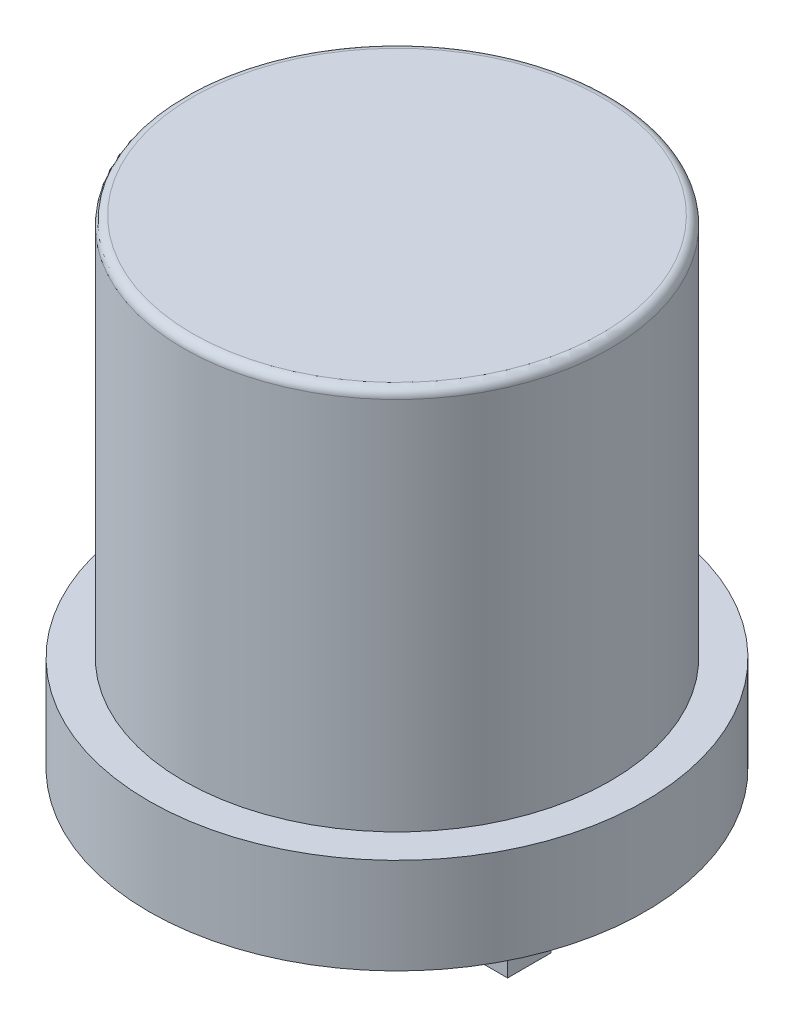
ISO-10303-21;
HEADER;
FILE_DESCRIPTION(('STEP AP214'),'2;1');
FILE_NAME('part.step','',(''),(''),'','','');
FILE_SCHEMA(('AUTOMOTIVE_DESIGN { 1 0 10303 214 1 1 1 1 }'));
ENDSEC;
DATA;
#1=APPLICATION_CONTEXT('core data for automotive mechanical design processes');
#2=APPLICATION_PROTOCOL_DEFINITION('international standard','automotive_design',2000,#1);
#3=PRODUCT_CONTEXT('',#1,'mechanical');
#4=PRODUCT('Part','Part','',(#3));
#5=PRODUCT_RELATED_PRODUCT_CATEGORY('part','',(#4));
#6=PRODUCT_DEFINITION_FORMATION('','',#4);
#7=PRODUCT_DEFINITION_CONTEXT('part definition',#1,'design');
#8=PRODUCT_DEFINITION('design','',#6,#7);
#9=PRODUCT_DEFINITION_SHAPE('','',#8);
#10=(LENGTH_UNIT() NAMED_UNIT(*) SI_UNIT(.MILLI.,.METRE.));
#11=(NAMED_UNIT(*) PLANE_ANGLE_UNIT() SI_UNIT($,.RADIAN.));
#12=(NAMED_UNIT(*) SI_UNIT($,.STERADIAN.) SOLID_ANGLE_UNIT());
#13=UNCERTAINTY_MEASURE_WITH_UNIT(LENGTH_MEASURE(1.E-05),#10,'distance_accuracy_value','');
#14=(GEOMETRIC_REPRESENTATION_CONTEXT(3) GLOBAL_UNCERTAINTY_ASSIGNED_CONTEXT((#13)) GLOBAL_UNIT_ASSIGNED_CONTEXT((#10,
#11,#12)) REPRESENTATION_CONTEXT('',''));
#15=CARTESIAN_POINT('',(0.,0.,0.));
#16=DIRECTION('',(0.,0.,1.));
#17=DIRECTION('',(1.,0.,0.));
#18=AXIS2_PLACEMENT_3D('',#15,#16,#17);
#19=CARTESIAN_POINT('',(2.85,1.1,0.));
#20=DIRECTION('',(0.,1.,0.));
#21=DIRECTION('',(0.,0.,1.));
#22=AXIS2_PLACEMENT_3D('',#19,#20,#21);
#23=PLANE('',#22);
#24=CARTESIAN_POINT('',(0.,1.1,0.));
#25=DIRECTION('',(0.,-1.,0.));
#26=DIRECTION('',(0.,0.,-1.));
#27=AXIS2_PLACEMENT_3D('',#24,#25,#26);
#28=CIRCLE('',#27,2.85);
#29=CARTESIAN_POINT('',(0.,1.1,-2.85));
#30=VERTEX_POINT('',#29);
#31=EDGE_CURVE('E344',#30,#30,#28,.T.);
#32=ORIENTED_EDGE('',*,*,#31,.F.);
#33=EDGE_LOOP('',(#32));
#34=FACE_BOUND('',#33,.T.);
#35=CARTESIAN_POINT('',(0.,1.1,0.));
#36=DIRECTION('',(0.,1.,0.));
#37=DIRECTION('',(0.,0.,1.));
#38=AXIS2_PLACEMENT_3D('',#35,#36,#37);
#39=CIRCLE('',#38,2.45);
#40=CARTESIAN_POINT('',(0.,1.1,2.45));
#41=VERTEX_POINT('',#40);
#42=EDGE_CURVE('E273',#41,#41,#39,.T.);
#43=ORIENTED_EDGE('',*,*,#42,.F.);
#44=EDGE_LOOP('',(#43));
#45=FACE_BOUND('',#44,.T.);
#46=ADVANCED_FACE('F35',(#34,#45),#23,.T.);
#47=CARTESIAN_POINT('',(0.,0.,0.));
#48=DIRECTION('',(0.,-1.,0.));
#49=DIRECTION('',(0.,0.,-1.));
#50=AXIS2_PLACEMENT_3D('',#47,#48,#49);
#51=PLANE('',#50);
#52=DIRECTION('',(-1.,0.,0.));
#53=VECTOR('',#52,1.);
#54=CARTESIAN_POINT('',(1.02,0.,0.25));
#55=LINE('',#54,#53);
#56=CARTESIAN_POINT('',(1.52,0.,0.25));
#57=VERTEX_POINT('',#56);
#58=CARTESIAN_POINT('',(1.02,0.,0.25));
#59=VERTEX_POINT('',#58);
#60=EDGE_CURVE('E328',#57,#59,#55,.T.);
#61=ORIENTED_EDGE('',*,*,#60,.F.);
#62=DIRECTION('',(0.,0.,1.));
#63=VECTOR('',#62,1.);
#64=CARTESIAN_POINT('',(1.52,0.,0.25));
#65=LINE('',#64,#63);
#66=CARTESIAN_POINT('',(1.52,0.,-0.25));
#67=VERTEX_POINT('',#66);
#68=EDGE_CURVE('E314',#67,#57,#65,.T.);
#69=ORIENTED_EDGE('',*,*,#68,.F.);
#70=DIRECTION('',(1.,0.,0.));
#71=VECTOR('',#70,1.);
#72=CARTESIAN_POINT('',(1.52,0.,-0.25));
#73=LINE('',#72,#71);
#74=CARTESIAN_POINT('',(1.02,0.,-0.25));
#75=VERTEX_POINT('',#74);
#76=EDGE_CURVE('E319',#75,#67,#73,.T.);
#77=ORIENTED_EDGE('',*,*,#76,.F.);
#78=DIRECTION('',(0.,0.,-1.));
#79=VECTOR('',#78,1.);
#80=CARTESIAN_POINT('',(1.02,0.,-0.25));
#81=LINE('',#80,#79);
#82=EDGE_CURVE('E330',#59,#75,#81,.T.);
#83=ORIENTED_EDGE('',*,*,#82,.F.);
#84=EDGE_LOOP('',(#61,#69,#77,#83));
#85=FACE_BOUND('',#84,.T.);
#86=CARTESIAN_POINT('',(0.,0.,0.));
#87=DIRECTION('',(0.,-1.,0.));
#88=DIRECTION('',(0.,0.,-1.));
#89=AXIS2_PLACEMENT_3D('',#86,#87,#88);
#90=CIRCLE('',#89,2.85);
#91=CARTESIAN_POINT('',(0.,0.,-2.85));
#92=VERTEX_POINT('',#91);
#93=EDGE_CURVE('E341',#92,#92,#90,.T.);
#94=ORIENTED_EDGE('',*,*,#93,.T.);
#95=EDGE_LOOP('',(#94));
#96=FACE_BOUND('',#95,.T.);
#97=DIRECTION('',(1.,0.,0.));
#98=VECTOR('',#97,1.);
#99=CARTESIAN_POINT('',(-1.02,0.,-0.25));
#100=LINE('',#99,#98);
#101=CARTESIAN_POINT('',(-1.52,0.,-0.25));
#102=VERTEX_POINT('',#101);
#103=CARTESIAN_POINT('',(-1.02,0.,-0.25));
#104=VERTEX_POINT('',#103);
#105=EDGE_CURVE('E301',#102,#104,#100,.T.);
#106=ORIENTED_EDGE('',*,*,#105,.F.);
#107=DIRECTION('',(0.,0.,-1.));
#108=VECTOR('',#107,1.);
#109=CARTESIAN_POINT('',(-1.52,0.,-0.25));
#110=LINE('',#109,#108);
#111=CARTESIAN_POINT('',(-1.52,0.,0.25));
#112=VERTEX_POINT('',#111);
#113=EDGE_CURVE('E287',#112,#102,#110,.T.);
#114=ORIENTED_EDGE('',*,*,#113,.F.);
#115=DIRECTION('',(-1.,0.,0.));
#116=VECTOR('',#115,1.);
#117=CARTESIAN_POINT('',(-1.52,0.,0.25));
#118=LINE('',#117,#116);
#119=CARTESIAN_POINT('',(-1.02,0.,0.25));
#120=VERTEX_POINT('',#119);
#121=EDGE_CURVE('E292',#120,#112,#118,.T.);
#122=ORIENTED_EDGE('',*,*,#121,.F.);
#123=DIRECTION('',(0.,0.,1.));
#124=VECTOR('',#123,1.);
#125=CARTESIAN_POINT('',(-1.02,0.,0.25));
#126=LINE('',#125,#124);
#127=EDGE_CURVE('E303',#104,#120,#126,.T.);
#128=ORIENTED_EDGE('',*,*,#127,.F.);
#129=EDGE_LOOP('',(#106,#114,#122,#128));
#130=FACE_BOUND('',#129,.T.);
#131=ADVANCED_FACE('F365',(#85,#96,#130),#51,.T.);
#132=CARTESIAN_POINT('',(0.,1.1,0.));
#133=DIRECTION('',(0.,-1.,0.));
#134=DIRECTION('',(0.,0.,-1.));
#135=AXIS2_PLACEMENT_3D('',#132,#133,#134);
#136=CYLINDRICAL_SURFACE('',#135,2.85);
#137=ORIENTED_EDGE('',*,*,#31,.T.);
#138=EDGE_LOOP('',(#137));
#139=FACE_BOUND('',#138,.T.);
#140=ORIENTED_EDGE('',*,*,#93,.F.);
#141=EDGE_LOOP('',(#140));
#142=FACE_BOUND('',#141,.T.);
#143=ADVANCED_FACE('F371',(#139,#142),#136,.T.);
#144=CARTESIAN_POINT('',(1.52,-1.2,0.25));
#145=DIRECTION('',(-1.,0.,0.));
#146=DIRECTION('',(0.,0.,1.));
#147=AXIS2_PLACEMENT_3D('',#144,#145,#146);
#148=PLANE('',#147);
#149=ORIENTED_EDGE('',*,*,#68,.T.);
#150=DIRECTION('',(0.,1.,0.));
#151=VECTOR('',#150,1.);
#152=CARTESIAN_POINT('',(1.52,-1.2,0.25));
#153=LINE('',#152,#151);
#154=CARTESIAN_POINT('',(1.52,-1.2,0.25));
#155=VERTEX_POINT('',#154);
#156=EDGE_CURVE('E339',#155,#57,#153,.T.);
#157=ORIENTED_EDGE('',*,*,#156,.F.);
#158=DIRECTION('',(0.,0.,1.));
#159=VECTOR('',#158,1.);
#160=CARTESIAN_POINT('',(1.52,-1.2,0.25));
#161=LINE('',#160,#159);
#162=CARTESIAN_POINT('',(1.52,-1.2,-0.25));
#163=VERTEX_POINT('',#162);
#164=EDGE_CURVE('E315',#163,#155,#161,.T.);
#165=ORIENTED_EDGE('',*,*,#164,.F.);
#166=DIRECTION('',(0.,1.,0.));
#167=VECTOR('',#166,1.);
#168=CARTESIAN_POINT('',(1.52,-1.2,-0.25));
#169=LINE('',#168,#167);
#170=EDGE_CURVE('E325',#163,#67,#169,.T.);
#171=ORIENTED_EDGE('',*,*,#170,.T.);
#172=EDGE_LOOP('',(#149,#157,#165,#171));
#173=FACE_BOUND('',#172,.T.);
#174=ADVANCED_FACE('F378',(#173),#148,.F.);
#175=CARTESIAN_POINT('',(1.02,-1.2,0.25));
#176=DIRECTION('',(0.,0.,-1.));
#177=DIRECTION('',(-1.,0.,0.));
#178=AXIS2_PLACEMENT_3D('',#175,#176,#177);
#179=PLANE('',#178);
#180=ORIENTED_EDGE('',*,*,#60,.T.);
#181=DIRECTION('',(0.,1.,0.));
#182=VECTOR('',#181,1.);
#183=CARTESIAN_POINT('',(1.02,-1.2,0.25));
#184=LINE('',#183,#182);
#185=CARTESIAN_POINT('',(1.02,-1.2,0.25));
#186=VERTEX_POINT('',#185);
#187=EDGE_CURVE('E336',#186,#59,#184,.T.);
#188=ORIENTED_EDGE('',*,*,#187,.F.);
#189=DIRECTION('',(-1.,0.,0.));
#190=VECTOR('',#189,1.);
#191=CARTESIAN_POINT('',(1.02,-1.2,0.25));
#192=LINE('',#191,#190);
#193=EDGE_CURVE('E318',#155,#186,#192,.T.);
#194=ORIENTED_EDGE('',*,*,#193,.F.);
#195=ORIENTED_EDGE('',*,*,#156,.T.);
#196=EDGE_LOOP('',(#180,#188,#194,#195));
#197=FACE_BOUND('',#196,.T.);
#198=ADVANCED_FACE('F383',(#197),#179,.F.);
#199=CARTESIAN_POINT('',(1.02,-1.2,-0.25));
#200=DIRECTION('',(1.,0.,0.));
#201=DIRECTION('',(0.,0.,-1.));
#202=AXIS2_PLACEMENT_3D('',#199,#200,#201);
#203=PLANE('',#202);
#204=ORIENTED_EDGE('',*,*,#82,.T.);
#205=DIRECTION('',(0.,1.,0.));
#206=VECTOR('',#205,1.);
#207=CARTESIAN_POINT('',(1.02,-1.2,-0.25));
#208=LINE('',#207,#206);
#209=CARTESIAN_POINT('',(1.02,-1.2,-0.25));
#210=VERTEX_POINT('',#209);
#211=EDGE_CURVE('E58',#210,#75,#208,.T.);
#212=ORIENTED_EDGE('',*,*,#211,.F.);
#213=DIRECTION('',(0.,0.,-1.));
#214=VECTOR('',#213,1.);
#215=CARTESIAN_POINT('',(1.02,-1.2,-0.25));
#216=LINE('',#215,#214);
#217=EDGE_CURVE('E321',#186,#210,#216,.T.);
#218=ORIENTED_EDGE('',*,*,#217,.F.);
#219=ORIENTED_EDGE('',*,*,#187,.T.);
#220=EDGE_LOOP('',(#204,#212,#218,#219));
#221=FACE_BOUND('',#220,.T.);
#222=ADVANCED_FACE('F429',(#221),#203,.F.);
#223=CARTESIAN_POINT('',(1.52,-1.2,-0.25));
#224=DIRECTION('',(0.,0.,1.));
#225=DIRECTION('',(1.,0.,0.));
#226=AXIS2_PLACEMENT_3D('',#223,#224,#225);
#227=PLANE('',#226);
#228=ORIENTED_EDGE('',*,*,#76,.T.);
#229=ORIENTED_EDGE('',*,*,#170,.F.);
#230=DIRECTION('',(1.,0.,0.));
#231=VECTOR('',#230,1.);
#232=CARTESIAN_POINT('',(1.52,-1.2,-0.25));
#233=LINE('',#232,#231);
#234=EDGE_CURVE('E323',#210,#163,#233,.T.);
#235=ORIENTED_EDGE('',*,*,#234,.F.);
#236=ORIENTED_EDGE('',*,*,#211,.T.);
#237=EDGE_LOOP('',(#228,#229,#235,#236));
#238=FACE_BOUND('',#237,.T.);
#239=ADVANCED_FACE('F425',(#238),#227,.F.);
#240=CARTESIAN_POINT('',(0.,-1.2,0.));
#241=DIRECTION('',(0.,1.,0.));
#242=DIRECTION('',(0.,0.,1.));
#243=AXIS2_PLACEMENT_3D('',#240,#241,#242);
#244=PLANE('',#243);
#245=CARTESIAN_POINT('',(1.27,-1.2,0.));
#246=DIRECTION('',(0.,-1.,0.));
#247=DIRECTION('',(0.,0.,-1.));
#248=AXIS2_PLACEMENT_3D('',#245,#246,#247);
#249=CIRCLE('',#248,0.102987613412572);
#250=CARTESIAN_POINT('',(1.27,-1.2,-0.102987613412572));
#251=VERTEX_POINT('',#250);
#252=EDGE_CURVE('E701',#251,#251,#249,.T.);
#253=ORIENTED_EDGE('',*,*,#252,.F.);
#254=EDGE_LOOP('',(#253));
#255=FACE_BOUND('',#254,.T.);
#256=ORIENTED_EDGE('',*,*,#164,.T.);
#257=ORIENTED_EDGE('',*,*,#193,.T.);
#258=ORIENTED_EDGE('',*,*,#217,.T.);
#259=ORIENTED_EDGE('',*,*,#234,.T.);
#260=EDGE_LOOP('',(#256,#257,#258,#259));
#261=FACE_BOUND('',#260,.T.);
#262=ADVANCED_FACE('F422',(#255,#261),#244,.F.);
#263=CARTESIAN_POINT('',(-1.52,-1.2,-0.25));
#264=DIRECTION('',(1.,0.,0.));
#265=DIRECTION('',(0.,0.,-1.));
#266=AXIS2_PLACEMENT_3D('',#263,#264,#265);
#267=PLANE('',#266);
#268=ORIENTED_EDGE('',*,*,#113,.T.);
#269=DIRECTION('',(0.,1.,0.));
#270=VECTOR('',#269,1.);
#271=CARTESIAN_POINT('',(-1.52,-1.2,-0.25));
#272=LINE('',#271,#270);
#273=CARTESIAN_POINT('',(-1.52,-1.2,-0.25));
#274=VERTEX_POINT('',#273);
#275=EDGE_CURVE('E312',#274,#102,#272,.T.);
#276=ORIENTED_EDGE('',*,*,#275,.F.);
#277=DIRECTION('',(0.,0.,-1.));
#278=VECTOR('',#277,1.);
#279=CARTESIAN_POINT('',(-1.52,-1.2,-0.25));
#280=LINE('',#279,#278);
#281=CARTESIAN_POINT('',(-1.52,-1.2,0.25));
#282=VERTEX_POINT('',#281);
#283=EDGE_CURVE('E288',#282,#274,#280,.T.);
#284=ORIENTED_EDGE('',*,*,#283,.F.);
#285=DIRECTION('',(0.,1.,0.));
#286=VECTOR('',#285,1.);
#287=CARTESIAN_POINT('',(-1.52,-1.2,0.25));
#288=LINE('',#287,#286);
#289=EDGE_CURVE('E298',#282,#112,#288,.T.);
#290=ORIENTED_EDGE('',*,*,#289,.T.);
#291=EDGE_LOOP('',(#268,#276,#284,#290));
#292=FACE_BOUND('',#291,.T.);
#293=ADVANCED_FACE('F405',(#292),#267,.F.);
#294=CARTESIAN_POINT('',(-1.02,-1.2,-0.25));
#295=DIRECTION('',(0.,0.,1.));
#296=DIRECTION('',(1.,0.,0.));
#297=AXIS2_PLACEMENT_3D('',#294,#295,#296);
#298=PLANE('',#297);
#299=ORIENTED_EDGE('',*,*,#105,.T.);
#300=DIRECTION('',(0.,1.,0.));
#301=VECTOR('',#300,1.);
#302=CARTESIAN_POINT('',(-1.02,-1.2,-0.25));
#303=LINE('',#302,#301);
#304=CARTESIAN_POINT('',(-1.02,-1.2,-0.25));
#305=VERTEX_POINT('',#304);
#306=EDGE_CURVE('E309',#305,#104,#303,.T.);
#307=ORIENTED_EDGE('',*,*,#306,.F.);
#308=DIRECTION('',(1.,0.,0.));
#309=VECTOR('',#308,1.);
#310=CARTESIAN_POINT('',(-1.02,-1.2,-0.25));
#311=LINE('',#310,#309);
#312=EDGE_CURVE('E291',#274,#305,#311,.T.);
#313=ORIENTED_EDGE('',*,*,#312,.F.);
#314=ORIENTED_EDGE('',*,*,#275,.T.);
#315=EDGE_LOOP('',(#299,#307,#313,#314));
#316=FACE_BOUND('',#315,.T.);
#317=ADVANCED_FACE('F395',(#316),#298,.F.);
#318=CARTESIAN_POINT('',(-1.02,-1.2,0.25));
#319=DIRECTION('',(-1.,0.,0.));
#320=DIRECTION('',(0.,0.,1.));
#321=AXIS2_PLACEMENT_3D('',#318,#319,#320);
#322=PLANE('',#321);
#323=ORIENTED_EDGE('',*,*,#127,.T.);
#324=DIRECTION('',(0.,1.,0.));
#325=VECTOR('',#324,1.);
#326=CARTESIAN_POINT('',(-1.02,-1.2,0.25));
#327=LINE('',#326,#325);
#328=CARTESIAN_POINT('',(-1.02,-1.2,0.25));
#329=VERTEX_POINT('',#328);
#330=EDGE_CURVE('E50',#329,#120,#327,.T.);
#331=ORIENTED_EDGE('',*,*,#330,.F.);
#332=DIRECTION('',(0.,0.,1.));
#333=VECTOR('',#332,1.);
#334=CARTESIAN_POINT('',(-1.02,-1.2,0.25));
#335=LINE('',#334,#333);
#336=EDGE_CURVE('E294',#305,#329,#335,.T.);
#337=ORIENTED_EDGE('',*,*,#336,.F.);
#338=ORIENTED_EDGE('',*,*,#306,.T.);
#339=EDGE_LOOP('',(#323,#331,#337,#338));
#340=FACE_BOUND('',#339,.T.);
#341=ADVANCED_FACE('F399',(#340),#322,.F.);
#342=CARTESIAN_POINT('',(-1.52,-1.2,0.25));
#343=DIRECTION('',(0.,0.,-1.));
#344=DIRECTION('',(-1.,0.,0.));
#345=AXIS2_PLACEMENT_3D('',#342,#343,#344);
#346=PLANE('',#345);
#347=ORIENTED_EDGE('',*,*,#121,.T.);
#348=ORIENTED_EDGE('',*,*,#289,.F.);
#349=DIRECTION('',(-1.,0.,0.));
#350=VECTOR('',#349,1.);
#351=CARTESIAN_POINT('',(-1.52,-1.2,0.25));
#352=LINE('',#351,#350);
#353=EDGE_CURVE('E296',#329,#282,#352,.T.);
#354=ORIENTED_EDGE('',*,*,#353,.F.);
#355=ORIENTED_EDGE('',*,*,#330,.T.);
#356=EDGE_LOOP('',(#347,#348,#354,#355));
#357=FACE_BOUND('',#356,.T.);
#358=ADVANCED_FACE('F406',(#357),#346,.F.);
#359=CARTESIAN_POINT('',(0.,-1.2,0.));
#360=DIRECTION('',(0.,1.,0.));
#361=DIRECTION('',(0.,0.,1.));
#362=AXIS2_PLACEMENT_3D('',#359,#360,#361);
#363=PLANE('',#362);
#364=CARTESIAN_POINT('',(-1.27,-1.2,0.));
#365=DIRECTION('',(0.,-1.,0.));
#366=DIRECTION('',(0.,0.,-1.));
#367=AXIS2_PLACEMENT_3D('',#364,#365,#366);
#368=CIRCLE('',#367,0.0715680431211374);
#369=CARTESIAN_POINT('',(-1.27,-1.2,-0.0715680431211374));
#370=VERTEX_POINT('',#369);
#371=EDGE_CURVE('E205',#370,#370,#368,.T.);
#372=ORIENTED_EDGE('',*,*,#371,.F.);
#373=EDGE_LOOP('',(#372));
#374=FACE_BOUND('',#373,.T.);
#375=ORIENTED_EDGE('',*,*,#283,.T.);
#376=ORIENTED_EDGE('',*,*,#312,.T.);
#377=ORIENTED_EDGE('',*,*,#336,.T.);
#378=ORIENTED_EDGE('',*,*,#353,.T.);
#379=EDGE_LOOP('',(#375,#376,#377,#378));
#380=FACE_BOUND('',#379,.T.);
#381=ADVANCED_FACE('F401',(#374,#380),#363,.F.);
#382=CARTESIAN_POINT('',(0.,5.5,0.));
#383=DIRECTION('',(0.,-1.,0.));
#384=DIRECTION('',(0.,0.,-1.));
#385=AXIS2_PLACEMENT_3D('',#382,#383,#384);
#386=CYLINDRICAL_SURFACE('',#385,2.45);
#387=CARTESIAN_POINT('',(0.,5.4,0.));
#388=DIRECTION('',(0.,1.,0.));
#389=DIRECTION('',(0.,0.,1.));
#390=AXIS2_PLACEMENT_3D('',#387,#388,#389);
#391=CIRCLE('',#390,2.45);
#392=CARTESIAN_POINT('',(0.,5.4,2.45));
#393=VERTEX_POINT('',#392);
#394=EDGE_CURVE('E11',#393,#393,#391,.F.);
#395=ORIENTED_EDGE('',*,*,#394,.T.);
#396=EDGE_LOOP('',(#395));
#397=FACE_BOUND('',#396,.T.);
#398=ORIENTED_EDGE('',*,*,#42,.T.);
#399=EDGE_LOOP('',(#398));
#400=FACE_BOUND('',#399,.T.);
#401=ADVANCED_FACE('F361',(#397,#400),#386,.T.);
#402=CARTESIAN_POINT('',(0.,5.5,0.));
#403=DIRECTION('',(0.,1.,0.));
#404=DIRECTION('',(0.,0.,1.));
#405=AXIS2_PLACEMENT_3D('',#402,#403,#404);
#406=PLANE('',#405);
#407=CARTESIAN_POINT('',(0.,5.5,0.));
#408=DIRECTION('',(0.,1.,0.));
#409=DIRECTION('',(0.,0.,1.));
#410=AXIS2_PLACEMENT_3D('',#407,#408,#409);
#411=CIRCLE('',#410,2.35);
#412=CARTESIAN_POINT('',(0.,5.5,2.35));
#413=VERTEX_POINT('',#412);
#414=EDGE_CURVE('E43',#413,#413,#411,.T.);
#415=ORIENTED_EDGE('',*,*,#414,.T.);
#416=EDGE_LOOP('',(#415));
#417=FACE_BOUND('',#416,.T.);
#418=ADVANCED_FACE('F349',(#417),#406,.T.);
#419=CARTESIAN_POINT('',(0.,5.4,0.));
#420=DIRECTION('',(0.,1.,0.));
#421=DIRECTION('',(0.,0.,1.));
#422=AXIS2_PLACEMENT_3D('',#419,#420,#421);
#423=TOROIDAL_SURFACE('',#422,2.35,0.1);
#424=ORIENTED_EDGE('',*,*,#394,.F.);
#425=EDGE_LOOP('',(#424));
#426=FACE_BOUND('',#425,.T.);
#427=ORIENTED_EDGE('',*,*,#414,.F.);
#428=EDGE_LOOP('',(#427));
#429=FACE_BOUND('',#428,.T.);
#430=ADVANCED_FACE('F37',(#426,#429),#423,.T.);
#431=CARTESIAN_POINT('',(-1.27,-0.2,0.));
#432=DIRECTION('',(0.,-1.,0.));
#433=DIRECTION('',(0.,0.,-1.));
#434=AXIS2_PLACEMENT_3D('',#431,#432,#433);
#435=CYLINDRICAL_SURFACE('',#434,0.0715680431211374);
#436=CARTESIAN_POINT('',(-1.27,-0.2,0.));
#437=DIRECTION('',(0.,-1.,0.));
#438=DIRECTION('',(0.,0.,-1.));
#439=AXIS2_PLACEMENT_3D('',#436,#437,#438);
#440=CIRCLE('',#439,0.0715680431211374);
#441=CARTESIAN_POINT('',(-1.27,-0.2,-0.0715680431211374));
#442=VERTEX_POINT('',#441);
#443=EDGE_CURVE('E214',#442,#442,#440,.T.);
#444=ORIENTED_EDGE('',*,*,#443,.F.);
#445=EDGE_LOOP('',(#444));
#446=FACE_BOUND('',#445,.T.);
#447=ORIENTED_EDGE('',*,*,#371,.T.);
#448=EDGE_LOOP('',(#447));
#449=FACE_BOUND('',#448,.T.);
#450=ADVANCED_FACE('F352',(#446,#449),#435,.F.);
#451=CARTESIAN_POINT('',(-1.27,-0.2,0.));
#452=DIRECTION('',(0.,-1.,0.));
#453=DIRECTION('',(0.,0.,-1.));
#454=AXIS2_PLACEMENT_3D('',#451,#452,#453);
#455=PLANE('',#454);
#456=ORIENTED_EDGE('',*,*,#443,.T.);
#457=EDGE_LOOP('',(#456));
#458=FACE_BOUND('',#457,.T.);
#459=ADVANCED_FACE('F358',(#458),#455,.T.);
#460=CARTESIAN_POINT('',(1.27,-0.2,0.));
#461=DIRECTION('',(0.,-1.,0.));
#462=DIRECTION('',(0.,0.,-1.));
#463=AXIS2_PLACEMENT_3D('',#460,#461,#462);
#464=CYLINDRICAL_SURFACE('',#463,0.102987613412572);
#465=CARTESIAN_POINT('',(1.27,-0.2,0.));
#466=DIRECTION('',(0.,-1.,0.));
#467=DIRECTION('',(0.,0.,-1.));
#468=AXIS2_PLACEMENT_3D('',#465,#466,#467);
#469=CIRCLE('',#468,0.102987613412572);
#470=CARTESIAN_POINT('',(1.27,-0.2,-0.102987613412572));
#471=VERTEX_POINT('',#470);
#472=EDGE_CURVE('E700',#471,#471,#469,.T.);
#473=ORIENTED_EDGE('',*,*,#472,.F.);
#474=EDGE_LOOP('',(#473));
#475=FACE_BOUND('',#474,.T.);
#476=ORIENTED_EDGE('',*,*,#252,.T.);
#477=EDGE_LOOP('',(#476));
#478=FACE_BOUND('',#477,.T.);
#479=ADVANCED_FACE('F675',(#475,#478),#464,.F.);
#480=CARTESIAN_POINT('',(1.27,-0.2,0.));
#481=DIRECTION('',(0.,-1.,0.));
#482=DIRECTION('',(0.,0.,-1.));
#483=AXIS2_PLACEMENT_3D('',#480,#481,#482);
#484=PLANE('',#483);
#485=ORIENTED_EDGE('',*,*,#472,.T.);
#486=EDGE_LOOP('',(#485));
#487=FACE_BOUND('',#486,.T.);
#488=ADVANCED_FACE('F684',(#487),#484,.T.);
#489=CLOSED_SHELL('',(#46,#131,#143,#174,#198,#222,#239,#262,#293,#317,#341,#358,#381,#401,#418,
#430,#450,#459,#479,#488));
#490=CARTESIAN_POINT('',(-1.52,0.252964397069142,-0.3));
#491=DIRECTION('',(-1.,0.,0.));
#492=DIRECTION('',(0.,0.,1.));
#493=AXIS2_PLACEMENT_3D('',#490,#491,#492);
#494=PLANE('',#493);
#495=DIRECTION('',(0.,-1.,0.));
#496=VECTOR('',#495,1.);
#497=CARTESIAN_POINT('',(-1.52,0.252964397069142,0.3));
#498=LINE('',#497,#496);
#499=CARTESIAN_POINT('',(-1.52,3.85296439706914,0.3));
#500=VERTEX_POINT('',#499);
#501=CARTESIAN_POINT('',(-1.52,0.252964397069142,0.3));
#502=VERTEX_POINT('',#501);
#503=EDGE_CURVE('E223',#500,#502,#498,.T.);
#504=ORIENTED_EDGE('',*,*,#503,.T.);
#505=DIRECTION('',(0.,0.,1.));
#506=VECTOR('',#505,1.);
#507=CARTESIAN_POINT('',(-1.52,0.252964397069142,-0.3));
#508=LINE('',#507,#506);
#509=CARTESIAN_POINT('',(-1.52,0.252964397069142,-0.3));
#510=VERTEX_POINT('',#509);
#511=EDGE_CURVE('E251',#510,#502,#508,.T.);
#512=ORIENTED_EDGE('',*,*,#511,.F.);
#513=DIRECTION('',(0.,-1.,0.));
#514=VECTOR('',#513,1.);
#515=CARTESIAN_POINT('',(-1.52,0.252964397069142,-0.3));
#516=LINE('',#515,#514);
#517=CARTESIAN_POINT('',(-1.52,3.85296439706914,-0.3));
#518=VERTEX_POINT('',#517);
#519=EDGE_CURVE('E229',#518,#510,#516,.T.);
#520=ORIENTED_EDGE('',*,*,#519,.F.);
#521=DIRECTION('',(0.,0.,1.));
#522=VECTOR('',#521,1.);
#523=CARTESIAN_POINT('',(-1.52,3.85296439706914,-0.3));
#524=LINE('',#523,#522);
#525=EDGE_CURVE('E271',#518,#500,#524,.T.);
#526=ORIENTED_EDGE('',*,*,#525,.T.);
#527=EDGE_LOOP('',(#504,#512,#520,#526));
#528=FACE_BOUND('',#527,.T.);
#529=ADVANCED_FACE('F509',(#528),#494,.F.);
#530=CARTESIAN_POINT('',(-1.52,3.85296439706914,-0.3));
#531=DIRECTION('',(0.,1.,0.));
#532=DIRECTION('',(0.,0.,1.));
#533=AXIS2_PLACEMENT_3D('',#530,#531,#532);
#534=PLANE('',#533);
#535=DIRECTION('',(-1.,0.,0.));
#536=VECTOR('',#535,1.);
#537=CARTESIAN_POINT('',(-1.52,3.85296439706914,0.3));
#538=LINE('',#537,#536);
#539=CARTESIAN_POINT('',(-1.27,3.85296439706914,0.3));
#540=VERTEX_POINT('',#539);
#541=EDGE_CURVE('E233',#540,#500,#538,.T.);
#542=ORIENTED_EDGE('',*,*,#541,.T.);
#543=ORIENTED_EDGE('',*,*,#525,.F.);
#544=DIRECTION('',(-1.,0.,0.));
#545=VECTOR('',#544,1.);
#546=CARTESIAN_POINT('',(-1.52,3.85296439706914,-0.3));
#547=LINE('',#546,#545);
#548=CARTESIAN_POINT('',(-1.27,3.85296439706914,-0.3));
#549=VERTEX_POINT('',#548);
#550=EDGE_CURVE('E248',#549,#518,#547,.T.);
#551=ORIENTED_EDGE('',*,*,#550,.F.);
#552=DIRECTION('',(0.,0.,1.));
#553=VECTOR('',#552,1.);
#554=CARTESIAN_POINT('',(-1.27,3.85296439706914,-0.3));
#555=LINE('',#554,#553);
#556=EDGE_CURVE('E274',#549,#540,#555,.T.);
#557=ORIENTED_EDGE('',*,*,#556,.T.);
#558=EDGE_LOOP('',(#542,#543,#551,#557));
#559=FACE_BOUND('',#558,.T.);
#560=ADVANCED_FACE('F513',(#559),#534,.F.);
#561=CARTESIAN_POINT('',(-1.27,4.75296439706914,-0.3));
#562=DIRECTION('',(-1.,0.,0.));
#563=DIRECTION('',(0.,-1.,0.));
#564=AXIS2_PLACEMENT_3D('',#561,#562,#563);
#565=PLANE('',#564);
#566=DIRECTION('',(0.,-1.,0.));
#567=VECTOR('',#566,1.);
#568=CARTESIAN_POINT('',(-1.27,4.75296439706914,0.3));
#569=LINE('',#568,#567);
#570=CARTESIAN_POINT('',(-1.27,4.75296439706914,0.3));
#571=VERTEX_POINT('',#570);
#572=EDGE_CURVE('E266',#571,#540,#569,.T.);
#573=ORIENTED_EDGE('',*,*,#572,.T.);
#574=ORIENTED_EDGE('',*,*,#556,.F.);
#575=DIRECTION('',(0.,-1.,0.));
#576=VECTOR('',#575,1.);
#577=CARTESIAN_POINT('',(-1.27,4.75296439706914,-0.3));
#578=LINE('',#577,#576);
#579=CARTESIAN_POINT('',(-1.27,4.75296439706914,-0.3));
#580=VERTEX_POINT('',#579);
#581=EDGE_CURVE('E245',#580,#549,#578,.T.);
#582=ORIENTED_EDGE('',*,*,#581,.F.);
#583=DIRECTION('',(0.,0.,1.));
#584=VECTOR('',#583,1.);
#585=CARTESIAN_POINT('',(-1.27,4.75296439706914,-0.3));
#586=LINE('',#585,#584);
#587=EDGE_CURVE('E276',#580,#571,#586,.T.);
#588=ORIENTED_EDGE('',*,*,#587,.T.);
#589=EDGE_LOOP('',(#573,#574,#582,#588));
#590=FACE_BOUND('',#589,.T.);
#591=ADVANCED_FACE('F525',(#590),#565,.F.);
#592=CARTESIAN_POINT('',(-0.181256175805036,3.85296439706914,-0.3));
#593=DIRECTION('',(0.637135112259481,0.770752131833639,0.));
#594=DIRECTION('',(-0.770752131833639,0.637135112259481,0.));
#595=AXIS2_PLACEMENT_3D('',#592,#593,#594);
#596=PLANE('',#595);
#597=DIRECTION('',(-0.770752131833639,0.63713511225948,0.));
#598=VECTOR('',#597,1.);
#599=CARTESIAN_POINT('',(-0.181256175805036,3.85296439706914,0.3));
#600=LINE('',#599,#598);
#601=CARTESIAN_POINT('',(-0.181256175805036,3.85296439706914,0.3));
#602=VERTEX_POINT('',#601);
#603=EDGE_CURVE('E263',#602,#571,#600,.T.);
#604=ORIENTED_EDGE('',*,*,#603,.T.);
#605=ORIENTED_EDGE('',*,*,#587,.F.);
#606=DIRECTION('',(-0.770752131833639,0.63713511225948,0.));
#607=VECTOR('',#606,1.);
#608=CARTESIAN_POINT('',(-0.181256175805036,3.85296439706914,-0.3));
#609=LINE('',#608,#607);
#610=CARTESIAN_POINT('',(-0.181256175805036,3.85296439706914,-0.3));
#611=VERTEX_POINT('',#610);
#612=EDGE_CURVE('E242',#611,#580,#609,.T.);
#613=ORIENTED_EDGE('',*,*,#612,.F.);
#614=DIRECTION('',(0.,0.,1.));
#615=VECTOR('',#614,1.);
#616=CARTESIAN_POINT('',(-0.181256175805036,3.85296439706914,-0.3));
#617=LINE('',#616,#615);
#618=EDGE_CURVE('E278',#611,#602,#617,.T.);
#619=ORIENTED_EDGE('',*,*,#618,.T.);
#620=EDGE_LOOP('',(#604,#605,#613,#619));
#621=FACE_BOUND('',#620,.T.);
#622=ADVANCED_FACE('F535',(#621),#596,.F.);
#623=CARTESIAN_POINT('',(-1.02,3.85296439706914,-0.3));
#624=DIRECTION('',(0.,-1.,0.));
#625=DIRECTION('',(0.,0.,-1.));
#626=AXIS2_PLACEMENT_3D('',#623,#624,#625);
#627=PLANE('',#626);
#628=DIRECTION('',(1.,0.,0.));
#629=VECTOR('',#628,1.);
#630=CARTESIAN_POINT('',(-1.02,3.85296439706914,0.3));
#631=LINE('',#630,#629);
#632=CARTESIAN_POINT('',(-1.02,3.85296439706914,0.3));
#633=VERTEX_POINT('',#632);
#634=EDGE_CURVE('E260',#633,#602,#631,.T.);
#635=ORIENTED_EDGE('',*,*,#634,.T.);
#636=ORIENTED_EDGE('',*,*,#618,.F.);
#637=DIRECTION('',(1.,0.,0.));
#638=VECTOR('',#637,1.);
#639=CARTESIAN_POINT('',(-1.02,3.85296439706914,-0.3));
#640=LINE('',#639,#638);
#641=CARTESIAN_POINT('',(-1.02,3.85296439706914,-0.3));
#642=VERTEX_POINT('',#641);
#643=EDGE_CURVE('E239',#642,#611,#640,.T.);
#644=ORIENTED_EDGE('',*,*,#643,.F.);
#645=DIRECTION('',(0.,0.,1.));
#646=VECTOR('',#645,1.);
#647=CARTESIAN_POINT('',(-1.02,3.85296439706914,-0.3));
#648=LINE('',#647,#646);
#649=EDGE_CURVE('E280',#642,#633,#648,.T.);
#650=ORIENTED_EDGE('',*,*,#649,.T.);
#651=EDGE_LOOP('',(#635,#636,#644,#650));
#652=FACE_BOUND('',#651,.T.);
#653=ADVANCED_FACE('F545',(#652),#627,.F.);
#654=CARTESIAN_POINT('',(-1.02,0.252964397069142,-0.3));
#655=DIRECTION('',(1.,0.,0.));
#656=DIRECTION('',(0.,0.,-1.));
#657=AXIS2_PLACEMENT_3D('',#654,#655,#656);
#658=PLANE('',#657);
#659=DIRECTION('',(0.,1.,0.));
#660=VECTOR('',#659,1.);
#661=CARTESIAN_POINT('',(-1.02,0.252964397069142,0.3));
#662=LINE('',#661,#660);
#663=CARTESIAN_POINT('',(-1.02,0.252964397069142,0.3));
#664=VERTEX_POINT('',#663);
#665=EDGE_CURVE('E257',#664,#633,#662,.T.);
#666=ORIENTED_EDGE('',*,*,#665,.T.);
#667=ORIENTED_EDGE('',*,*,#649,.F.);
#668=DIRECTION('',(0.,1.,0.));
#669=VECTOR('',#668,1.);
#670=CARTESIAN_POINT('',(-1.02,0.252964397069142,-0.3));
#671=LINE('',#670,#669);
#672=CARTESIAN_POINT('',(-1.02,0.252964397069142,-0.3));
#673=VERTEX_POINT('',#672);
#674=EDGE_CURVE('E236',#673,#642,#671,.T.);
#675=ORIENTED_EDGE('',*,*,#674,.F.);
#676=DIRECTION('',(0.,0.,1.));
#677=VECTOR('',#676,1.);
#678=CARTESIAN_POINT('',(-1.02,0.252964397069142,-0.3));
#679=LINE('',#678,#677);
#680=EDGE_CURVE('E282',#673,#664,#679,.T.);
#681=ORIENTED_EDGE('',*,*,#680,.T.);
#682=EDGE_LOOP('',(#666,#667,#675,#681));
#683=FACE_BOUND('',#682,.T.);
#684=ADVANCED_FACE('F555',(#683),#658,.F.);
#685=CARTESIAN_POINT('',(-1.52,0.252964397069142,-0.3));
#686=DIRECTION('',(0.,-1.,0.));
#687=DIRECTION('',(0.,0.,-1.));
#688=AXIS2_PLACEMENT_3D('',#685,#686,#687);
#689=PLANE('',#688);
#690=DIRECTION('',(1.,0.,0.));
#691=VECTOR('',#690,1.);
#692=CARTESIAN_POINT('',(-1.52,0.252964397069142,0.3));
#693=LINE('',#692,#691);
#694=EDGE_CURVE('E254',#502,#664,#693,.T.);
#695=ORIENTED_EDGE('',*,*,#694,.T.);
#696=ORIENTED_EDGE('',*,*,#680,.F.);
#697=DIRECTION('',(1.,0.,0.));
#698=VECTOR('',#697,1.);
#699=CARTESIAN_POINT('',(-1.52,0.252964397069142,-0.3));
#700=LINE('',#699,#698);
#701=EDGE_CURVE('E232',#510,#673,#700,.T.);
#702=ORIENTED_EDGE('',*,*,#701,.F.);
#703=ORIENTED_EDGE('',*,*,#511,.T.);
#704=EDGE_LOOP('',(#695,#696,#702,#703));
#705=FACE_BOUND('',#704,.T.);
#706=ADVANCED_FACE('F565',(#705),#689,.F.);
#707=CARTESIAN_POINT('',(0.,0.,-0.3));
#708=DIRECTION('',(0.,0.,-1.));
#709=DIRECTION('',(-1.,0.,0.));
#710=AXIS2_PLACEMENT_3D('',#707,#708,#709);
#711=PLANE('',#710);
#712=ORIENTED_EDGE('',*,*,#519,.T.);
#713=ORIENTED_EDGE('',*,*,#701,.T.);
#714=ORIENTED_EDGE('',*,*,#674,.T.);
#715=ORIENTED_EDGE('',*,*,#643,.T.);
#716=ORIENTED_EDGE('',*,*,#612,.T.);
#717=ORIENTED_EDGE('',*,*,#581,.T.);
#718=ORIENTED_EDGE('',*,*,#550,.T.);
#719=EDGE_LOOP('',(#712,#713,#714,#715,#716,#717,#718));
#720=FACE_BOUND('',#719,.T.);
#721=ADVANCED_FACE('F575',(#720),#711,.F.);
#722=CARTESIAN_POINT('',(0.,0.,0.3));
#723=DIRECTION('',(0.,0.,-1.));
#724=DIRECTION('',(-1.,0.,0.));
#725=AXIS2_PLACEMENT_3D('',#722,#723,#724);
#726=PLANE('',#725);
#727=ORIENTED_EDGE('',*,*,#503,.F.);
#728=ORIENTED_EDGE('',*,*,#541,.F.);
#729=ORIENTED_EDGE('',*,*,#572,.F.);
#730=ORIENTED_EDGE('',*,*,#603,.F.);
#731=ORIENTED_EDGE('',*,*,#634,.F.);
#732=ORIENTED_EDGE('',*,*,#665,.F.);
#733=ORIENTED_EDGE('',*,*,#694,.F.);
#734=EDGE_LOOP('',(#727,#728,#729,#730,#731,#732,#733));
#735=FACE_BOUND('',#734,.T.);
#736=ADVANCED_FACE('F585',(#735),#726,.T.);
#737=CLOSED_SHELL('',(#529,#560,#591,#622,#653,#684,#706,#721,#736));
#738=CARTESIAN_POINT('',(1.52,0.252964397069142,-0.3));
#739=DIRECTION('',(1.,0.,0.));
#740=DIRECTION('',(0.,0.,-1.));
#741=AXIS2_PLACEMENT_3D('',#738,#739,#740);
#742=PLANE('',#741);
#743=DIRECTION('',(0.,1.,0.));
#744=VECTOR('',#743,1.);
#745=CARTESIAN_POINT('',(1.52,0.252964397069142,0.3));
#746=LINE('',#745,#744);
#747=CARTESIAN_POINT('',(1.52,0.252964397069142,0.3));
#748=VERTEX_POINT('',#747);
#749=CARTESIAN_POINT('',(1.52,4.75296439706914,0.3));
#750=VERTEX_POINT('',#749);
#751=EDGE_CURVE('E181',#748,#750,#746,.T.);
#752=ORIENTED_EDGE('',*,*,#751,.T.);
#753=DIRECTION('',(0.,0.,1.));
#754=VECTOR('',#753,1.);
#755=CARTESIAN_POINT('',(1.52,4.75296439706914,-0.3));
#756=LINE('',#755,#754);
#757=CARTESIAN_POINT('',(1.52,4.75296439706914,-0.3));
#758=VERTEX_POINT('',#757);
#759=EDGE_CURVE('E174',#758,#750,#756,.T.);
#760=ORIENTED_EDGE('',*,*,#759,.F.);
#761=DIRECTION('',(0.,1.,0.));
#762=VECTOR('',#761,1.);
#763=CARTESIAN_POINT('',(1.52,0.252964397069142,-0.3));
#764=LINE('',#763,#762);
#765=CARTESIAN_POINT('',(1.52,0.252964397069142,-0.3));
#766=VERTEX_POINT('',#765);
#767=EDGE_CURVE('E178',#766,#758,#764,.T.);
#768=ORIENTED_EDGE('',*,*,#767,.F.);
#769=DIRECTION('',(0.,0.,1.));
#770=VECTOR('',#769,1.);
#771=CARTESIAN_POINT('',(1.52,0.252964397069142,-0.3));
#772=LINE('',#771,#770);
#773=EDGE_CURVE('E221',#766,#748,#772,.T.);
#774=ORIENTED_EDGE('',*,*,#773,.T.);
#775=EDGE_LOOP('',(#752,#760,#768,#774));
#776=FACE_BOUND('',#775,.T.);
#777=ADVANCED_FACE('F176',(#776),#742,.F.);
#778=CARTESIAN_POINT('',(1.52,0.252964397069142,-0.3));
#779=DIRECTION('',(0.,-1.,0.));
#780=DIRECTION('',(1.,0.,0.));
#781=AXIS2_PLACEMENT_3D('',#778,#779,#780);
#782=PLANE('',#781);
#783=DIRECTION('',(1.,0.,0.));
#784=VECTOR('',#783,1.);
#785=CARTESIAN_POINT('',(1.52,0.252964397069142,0.3));
#786=LINE('',#785,#784);
#787=CARTESIAN_POINT('',(1.02,0.252964397069142,0.3));
#788=VERTEX_POINT('',#787);
#789=EDGE_CURVE('E199',#788,#748,#786,.T.);
#790=ORIENTED_EDGE('',*,*,#789,.T.);
#791=ORIENTED_EDGE('',*,*,#773,.F.);
#792=DIRECTION('',(1.,0.,0.));
#793=VECTOR('',#792,1.);
#794=CARTESIAN_POINT('',(1.52,0.252964397069142,-0.3));
#795=LINE('',#794,#793);
#796=CARTESIAN_POINT('',(1.02,0.252964397069142,-0.3));
#797=VERTEX_POINT('',#796);
#798=EDGE_CURVE('E186',#797,#766,#795,.T.);
#799=ORIENTED_EDGE('',*,*,#798,.F.);
#800=DIRECTION('',(0.,0.,1.));
#801=VECTOR('',#800,1.);
#802=CARTESIAN_POINT('',(1.02,0.252964397069142,-0.3));
#803=LINE('',#802,#801);
#804=EDGE_CURVE('E224',#797,#788,#803,.T.);
#805=ORIENTED_EDGE('',*,*,#804,.T.);
#806=EDGE_LOOP('',(#790,#791,#799,#805));
#807=FACE_BOUND('',#806,.T.);
#808=ADVANCED_FACE('F604',(#807),#782,.F.);
#809=CARTESIAN_POINT('',(1.02,0.252964397069142,-0.3));
#810=DIRECTION('',(-1.,0.,0.));
#811=DIRECTION('',(0.,0.,1.));
#812=AXIS2_PLACEMENT_3D('',#809,#810,#811);
#813=PLANE('',#812);
#814=DIRECTION('',(0.,-1.,0.));
#815=VECTOR('',#814,1.);
#816=CARTESIAN_POINT('',(1.02,0.252964397069142,0.3));
#817=LINE('',#816,#815);
#818=CARTESIAN_POINT('',(1.02,3.51678586681614,0.3));
#819=VERTEX_POINT('',#818);
#820=EDGE_CURVE('E202',#819,#788,#817,.T.);
#821=ORIENTED_EDGE('',*,*,#820,.T.);
#822=ORIENTED_EDGE('',*,*,#804,.F.);
#823=DIRECTION('',(0.,-1.,0.));
#824=VECTOR('',#823,1.);
#825=CARTESIAN_POINT('',(1.02,0.252964397069142,-0.3));
#826=LINE('',#825,#824);
#827=CARTESIAN_POINT('',(1.02,3.51678586681614,-0.3));
#828=VERTEX_POINT('',#827);
#829=EDGE_CURVE('E209',#828,#797,#826,.T.);
#830=ORIENTED_EDGE('',*,*,#829,.F.);
#831=DIRECTION('',(0.,0.,1.));
#832=VECTOR('',#831,1.);
#833=CARTESIAN_POINT('',(1.02,3.51678586681614,-0.3));
#834=LINE('',#833,#832);
#835=EDGE_CURVE('E226',#828,#819,#834,.T.);
#836=ORIENTED_EDGE('',*,*,#835,.T.);
#837=EDGE_LOOP('',(#821,#822,#830,#836));
#838=FACE_BOUND('',#837,.T.);
#839=ADVANCED_FACE('F615',(#838),#813,.F.);
#840=CARTESIAN_POINT('',(-0.47542415601707,4.75296439706914,-0.3));
#841=DIRECTION('',(-0.63713511225948,-0.770752131833639,0.));
#842=DIRECTION('',(0.770752131833639,-0.63713511225948,0.));
#843=AXIS2_PLACEMENT_3D('',#840,#841,#842);
#844=PLANE('',#843);
#845=DIRECTION('',(0.770752131833639,-0.63713511225948,0.));
#846=VECTOR('',#845,1.);
#847=CARTESIAN_POINT('',(-0.47542415601707,4.75296439706914,0.3));
#848=LINE('',#847,#846);
#849=CARTESIAN_POINT('',(-0.47542415601707,4.75296439706914,0.3));
#850=VERTEX_POINT('',#849);
#851=EDGE_CURVE('E216',#850,#819,#848,.T.);
#852=ORIENTED_EDGE('',*,*,#851,.T.);
#853=ORIENTED_EDGE('',*,*,#835,.F.);
#854=DIRECTION('',(0.770752131833639,-0.63713511225948,0.));
#855=VECTOR('',#854,1.);
#856=CARTESIAN_POINT('',(-0.47542415601707,4.75296439706914,-0.3));
#857=LINE('',#856,#855);
#858=CARTESIAN_POINT('',(-0.47542415601707,4.75296439706914,-0.3));
#859=VERTEX_POINT('',#858);
#860=EDGE_CURVE('E194',#859,#828,#857,.T.);
#861=ORIENTED_EDGE('',*,*,#860,.F.);
#862=DIRECTION('',(0.,0.,1.));
#863=VECTOR('',#862,1.);
#864=CARTESIAN_POINT('',(-0.47542415601707,4.75296439706914,-0.3));
#865=LINE('',#864,#863);
#866=EDGE_CURVE('E185',#859,#850,#865,.T.);
#867=ORIENTED_EDGE('',*,*,#866,.T.);
#868=EDGE_LOOP('',(#852,#853,#861,#867));
#869=FACE_BOUND('',#868,.T.);
#870=ADVANCED_FACE('F625',(#869),#844,.F.);
#871=CARTESIAN_POINT('',(-0.47542415601707,4.75296439706914,-0.3));
#872=DIRECTION('',(0.,1.,0.));
#873=DIRECTION('',(0.,0.,1.));
#874=AXIS2_PLACEMENT_3D('',#871,#872,#873);
#875=PLANE('',#874);
#876=DIRECTION('',(-1.,0.,0.));
#877=VECTOR('',#876,1.);
#878=CARTESIAN_POINT('',(-0.47542415601707,4.75296439706914,0.3));
#879=LINE('',#878,#877);
#880=EDGE_CURVE('E213',#750,#850,#879,.T.);
#881=ORIENTED_EDGE('',*,*,#880,.T.);
#882=ORIENTED_EDGE('',*,*,#866,.F.);
#883=DIRECTION('',(-1.,0.,0.));
#884=VECTOR('',#883,1.);
#885=CARTESIAN_POINT('',(-0.47542415601707,4.75296439706914,-0.3));
#886=LINE('',#885,#884);
#887=EDGE_CURVE('E189',#758,#859,#886,.T.);
#888=ORIENTED_EDGE('',*,*,#887,.F.);
#889=ORIENTED_EDGE('',*,*,#759,.T.);
#890=EDGE_LOOP('',(#881,#882,#888,#889));
#891=FACE_BOUND('',#890,.T.);
#892=ADVANCED_FACE('F190',(#891),#875,.F.);
#893=CARTESIAN_POINT('',(0.,0.,-0.3));
#894=DIRECTION('',(0.,0.,-1.));
#895=DIRECTION('',(-1.,0.,0.));
#896=AXIS2_PLACEMENT_3D('',#893,#894,#895);
#897=PLANE('',#896);
#898=ORIENTED_EDGE('',*,*,#767,.T.);
#899=ORIENTED_EDGE('',*,*,#887,.T.);
#900=ORIENTED_EDGE('',*,*,#860,.T.);
#901=ORIENTED_EDGE('',*,*,#829,.T.);
#902=ORIENTED_EDGE('',*,*,#798,.T.);
#903=EDGE_LOOP('',(#898,#899,#900,#901,#902));
#904=FACE_BOUND('',#903,.T.);
#905=ADVANCED_FACE('F196',(#904),#897,.F.);
#906=CARTESIAN_POINT('',(0.,0.,0.3));
#907=DIRECTION('',(0.,0.,-1.));
#908=DIRECTION('',(-1.,0.,0.));
#909=AXIS2_PLACEMENT_3D('',#906,#907,#908);
#910=PLANE('',#909);
#911=ORIENTED_EDGE('',*,*,#751,.F.);
#912=ORIENTED_EDGE('',*,*,#789,.F.);
#913=ORIENTED_EDGE('',*,*,#820,.F.);
#914=ORIENTED_EDGE('',*,*,#851,.F.);
#915=ORIENTED_EDGE('',*,*,#880,.F.);
#916=EDGE_LOOP('',(#911,#912,#913,#914,#915));
#917=FACE_BOUND('',#916,.T.);
#918=ADVANCED_FACE('F651',(#917),#910,.T.);
#919=CLOSED_SHELL('',(#777,#808,#839,#870,#892,#905,#918));
#920=ORIENTED_CLOSED_SHELL('',*,#489,.T.);
#921=ORIENTED_CLOSED_SHELL('',*,#737,.T.);
#922=BREP_WITH_VOIDS('B2',#919,(#920,#921));
#923=ADVANCED_BREP_SHAPE_REPRESENTATION('',(#18,#922),#14);
#924=SHAPE_DEFINITION_REPRESENTATION(#9,#923);
ENDSEC;
END-ISO-10303-21;
